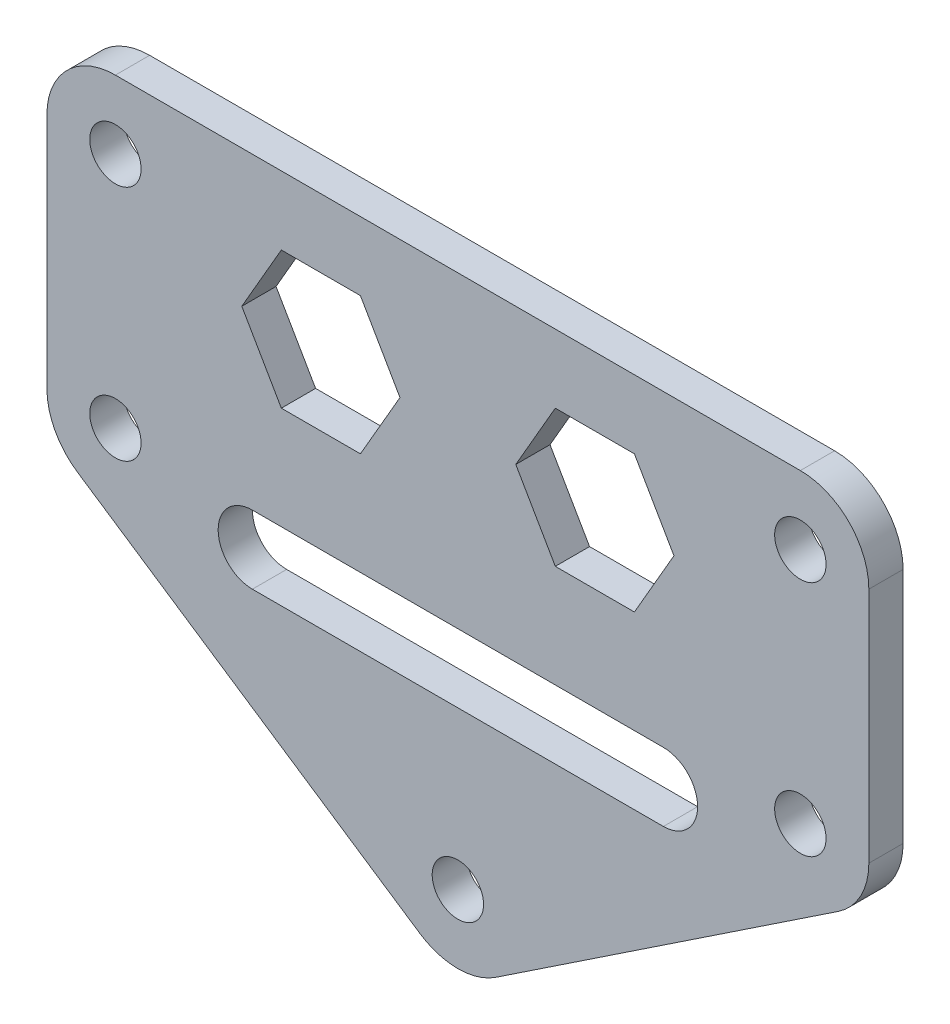
ISO-10303-21;
HEADER;
FILE_DESCRIPTION(('STEP AP214'),'2;1');
FILE_NAME('part.step','',(''),(''),'','','');
FILE_SCHEMA(('AUTOMOTIVE_DESIGN { 1 0 10303 214 1 1 1 1 }'));
ENDSEC;
DATA;
#1=APPLICATION_CONTEXT('core data for automotive mechanical design processes');
#2=APPLICATION_PROTOCOL_DEFINITION('international standard','automotive_design',2000,#1);
#3=PRODUCT_CONTEXT('',#1,'mechanical');
#4=PRODUCT('Part','Part','',(#3));
#5=PRODUCT_RELATED_PRODUCT_CATEGORY('part','',(#4));
#6=PRODUCT_DEFINITION_FORMATION('','',#4);
#7=PRODUCT_DEFINITION_CONTEXT('part definition',#1,'design');
#8=PRODUCT_DEFINITION('design','',#6,#7);
#9=PRODUCT_DEFINITION_SHAPE('','',#8);
#10=(LENGTH_UNIT() NAMED_UNIT(*) SI_UNIT(.MILLI.,.METRE.));
#11=(NAMED_UNIT(*) PLANE_ANGLE_UNIT() SI_UNIT($,.RADIAN.));
#12=(NAMED_UNIT(*) SI_UNIT($,.STERADIAN.) SOLID_ANGLE_UNIT());
#13=UNCERTAINTY_MEASURE_WITH_UNIT(LENGTH_MEASURE(1.E-05),#10,'distance_accuracy_value','');
#14=(GEOMETRIC_REPRESENTATION_CONTEXT(3) GLOBAL_UNCERTAINTY_ASSIGNED_CONTEXT((#13)) GLOBAL_UNIT_ASSIGNED_CONTEXT((#10,
#11,#12)) REPRESENTATION_CONTEXT('',''));
#15=CARTESIAN_POINT('',(0.,0.,0.));
#16=DIRECTION('',(0.,0.,1.));
#17=DIRECTION('',(1.,0.,0.));
#18=AXIS2_PLACEMENT_3D('',#15,#16,#17);
#19=CARTESIAN_POINT('',(63.5,57.5968337327975,6.35));
#20=DIRECTION('',(0.,0.,1.));
#21=DIRECTION('',(1.,0.,0.));
#22=AXIS2_PLACEMENT_3D('',#19,#20,#21);
#23=PLANE('',#22);
#24=CARTESIAN_POINT('',(63.5,57.5968337327975,6.35));
#25=DIRECTION('',(0.,0.,1.));
#26=DIRECTION('',(1.,0.,0.));
#27=AXIS2_PLACEMENT_3D('',#24,#25,#26);
#28=CIRCLE('',#27,4.7625);
#29=CARTESIAN_POINT('',(68.2625,57.5968337327975,6.35));
#30=VERTEX_POINT('',#29);
#31=EDGE_CURVE('E400',#30,#30,#28,.T.);
#32=ORIENTED_EDGE('',*,*,#31,.F.);
#33=EDGE_LOOP('',(#32));
#34=FACE_BOUND('',#33,.T.);
#35=CARTESIAN_POINT('',(-63.5,57.5968337327975,6.35));
#36=DIRECTION('',(0.,0.,1.));
#37=DIRECTION('',(1.,0.,0.));
#38=AXIS2_PLACEMENT_3D('',#35,#36,#37);
#39=CIRCLE('',#38,4.7625);
#40=CARTESIAN_POINT('',(-58.7375,57.5968337327975,6.35));
#41=VERTEX_POINT('',#40);
#42=EDGE_CURVE('E416',#41,#41,#39,.T.);
#43=ORIENTED_EDGE('',*,*,#42,.F.);
#44=EDGE_LOOP('',(#43));
#45=FACE_BOUND('',#44,.T.);
#46=CARTESIAN_POINT('',(63.5,57.5968337327975,6.35));
#47=DIRECTION('',(0.,0.,1.));
#48=DIRECTION('',(1.,0.,0.));
#49=AXIS2_PLACEMENT_3D('',#46,#47,#48);
#50=CIRCLE('',#49,12.7);
#51=CARTESIAN_POINT('',(70.5446924920604,47.029794994707,6.35));
#52=VERTEX_POINT('',#51);
#53=CARTESIAN_POINT('',(76.2,57.5968337327976,6.35));
#54=VERTEX_POINT('',#53);
#55=EDGE_CURVE('E432',#52,#54,#50,.T.);
#56=ORIENTED_EDGE('',*,*,#55,.T.);
#57=DIRECTION('',(0.,1.,0.));
#58=VECTOR('',#57,1.);
#59=CARTESIAN_POINT('',(76.2,57.5968337327976,6.35));
#60=LINE('',#59,#58);
#61=CARTESIAN_POINT('',(76.2,101.6,6.35));
#62=VERTEX_POINT('',#61);
#63=EDGE_CURVE('E436',#54,#62,#60,.T.);
#64=ORIENTED_EDGE('',*,*,#63,.T.);
#65=CARTESIAN_POINT('',(63.5,101.6,6.35));
#66=DIRECTION('',(0.,0.,1.));
#67=DIRECTION('',(1.,0.,0.));
#68=AXIS2_PLACEMENT_3D('',#65,#66,#67);
#69=CIRCLE('',#68,12.7);
#70=CARTESIAN_POINT('',(63.4999999999999,114.3,6.35));
#71=VERTEX_POINT('',#70);
#72=EDGE_CURVE('E440',#62,#71,#69,.T.);
#73=ORIENTED_EDGE('',*,*,#72,.T.);
#74=DIRECTION('',(-1.,0.,0.));
#75=VECTOR('',#74,1.);
#76=CARTESIAN_POINT('',(63.4999999999999,114.3,6.35));
#77=LINE('',#76,#75);
#78=CARTESIAN_POINT('',(-63.4999999999999,114.3,6.35));
#79=VERTEX_POINT('',#78);
#80=EDGE_CURVE('E443',#71,#79,#77,.T.);
#81=ORIENTED_EDGE('',*,*,#80,.T.);
#82=CARTESIAN_POINT('',(-63.5,101.6,6.35));
#83=DIRECTION('',(0.,0.,1.));
#84=DIRECTION('',(1.,0.,0.));
#85=AXIS2_PLACEMENT_3D('',#82,#83,#84);
#86=CIRCLE('',#85,12.7);
#87=CARTESIAN_POINT('',(-76.2,101.6,6.35));
#88=VERTEX_POINT('',#87);
#89=EDGE_CURVE('E446',#79,#88,#86,.T.);
#90=ORIENTED_EDGE('',*,*,#89,.T.);
#91=DIRECTION('',(0.,-1.,0.));
#92=VECTOR('',#91,1.);
#93=CARTESIAN_POINT('',(-76.2,101.6,6.35));
#94=LINE('',#93,#92);
#95=CARTESIAN_POINT('',(-76.2,57.5968337327975,6.35));
#96=VERTEX_POINT('',#95);
#97=EDGE_CURVE('E449',#88,#96,#94,.T.);
#98=ORIENTED_EDGE('',*,*,#97,.T.);
#99=CARTESIAN_POINT('',(-63.5,57.5968337327975,6.35));
#100=DIRECTION('',(0.,0.,1.));
#101=DIRECTION('',(1.,0.,0.));
#102=AXIS2_PLACEMENT_3D('',#99,#100,#101);
#103=CIRCLE('',#102,12.7);
#104=CARTESIAN_POINT('',(-70.5446924920604,47.0297949947069,6.35));
#105=VERTEX_POINT('',#104);
#106=EDGE_CURVE('E452',#96,#105,#103,.T.);
#107=ORIENTED_EDGE('',*,*,#106,.T.);
#108=DIRECTION('',(0.832050294337844,-0.554700196225229,0.));
#109=VECTOR('',#108,1.);
#110=CARTESIAN_POINT('',(-70.5446924920604,47.0297949947069,6.35));
#111=LINE('',#110,#109);
#112=CARTESIAN_POINT('',(-7.0446924920604,4.6964616613736,6.35));
#113=VERTEX_POINT('',#112);
#114=EDGE_CURVE('E455',#105,#113,#111,.T.);
#115=ORIENTED_EDGE('',*,*,#114,.T.);
#116=CARTESIAN_POINT('',(0.,15.2635003994642,6.35));
#117=DIRECTION('',(0.,0.,1.));
#118=DIRECTION('',(-1.,0.,0.));
#119=AXIS2_PLACEMENT_3D('',#116,#117,#118);
#120=CIRCLE('',#119,12.7);
#121=CARTESIAN_POINT('',(7.04469249206042,4.6964616613736,6.35));
#122=VERTEX_POINT('',#121);
#123=EDGE_CURVE('E458',#113,#122,#120,.T.);
#124=ORIENTED_EDGE('',*,*,#123,.T.);
#125=DIRECTION('',(0.832050294337843,0.554700196225229,0.));
#126=VECTOR('',#125,1.);
#127=CARTESIAN_POINT('',(7.04469249206042,4.6964616613736,6.35));
#128=LINE('',#127,#126);
#129=EDGE_CURVE('E461',#122,#52,#128,.T.);
#130=ORIENTED_EDGE('',*,*,#129,.T.);
#131=EDGE_LOOP('',(#56,#64,#73,#81,#90,#98,#107,#115,#124,#130));
#132=FACE_BOUND('',#131,.T.);
#133=CARTESIAN_POINT('',(-63.5,101.6,6.35));
#134=DIRECTION('',(0.,0.,1.));
#135=DIRECTION('',(1.,0.,0.));
#136=AXIS2_PLACEMENT_3D('',#133,#134,#135);
#137=CIRCLE('',#136,4.7625);
#138=CARTESIAN_POINT('',(-58.7375,101.6,6.35));
#139=VERTEX_POINT('',#138);
#140=EDGE_CURVE('E424',#139,#139,#137,.T.);
#141=ORIENTED_EDGE('',*,*,#140,.F.);
#142=EDGE_LOOP('',(#141));
#143=FACE_BOUND('',#142,.T.);
#144=CARTESIAN_POINT('',(63.5,101.6,6.35));
#145=DIRECTION('',(0.,0.,1.));
#146=DIRECTION('',(1.,0.,0.));
#147=AXIS2_PLACEMENT_3D('',#144,#145,#146);
#148=CIRCLE('',#147,4.7625);
#149=CARTESIAN_POINT('',(68.2625,101.6,6.35));
#150=VERTEX_POINT('',#149);
#151=EDGE_CURVE('E408',#150,#150,#148,.T.);
#152=ORIENTED_EDGE('',*,*,#151,.F.);
#153=EDGE_LOOP('',(#152));
#154=FACE_BOUND('',#153,.T.);
#155=CARTESIAN_POINT('',(0.,15.2635003994642,6.35));
#156=DIRECTION('',(0.,0.,1.));
#157=DIRECTION('',(1.,0.,0.));
#158=AXIS2_PLACEMENT_3D('',#155,#156,#157);
#159=CIRCLE('',#158,4.7625);
#160=CARTESIAN_POINT('',(4.7625,15.2635003994642,6.35));
#161=VERTEX_POINT('',#160);
#162=EDGE_CURVE('E392',#161,#161,#159,.T.);
#163=ORIENTED_EDGE('',*,*,#162,.F.);
#164=EDGE_LOOP('',(#163));
#165=FACE_BOUND('',#164,.T.);
#166=DIRECTION('',(1.,0.,0.));
#167=VECTOR('',#166,1.);
#168=CARTESIAN_POINT('',(-38.1,44.45,6.35));
#169=LINE('',#168,#167);
#170=CARTESIAN_POINT('',(-38.1,44.45,6.35));
#171=VERTEX_POINT('',#170);
#172=CARTESIAN_POINT('',(38.1,44.45,6.35));
#173=VERTEX_POINT('',#172);
#174=EDGE_CURVE('E352',#171,#173,#169,.T.);
#175=ORIENTED_EDGE('',*,*,#174,.F.);
#176=CARTESIAN_POINT('',(-38.1,50.8,6.35));
#177=DIRECTION('',(0.,0.,1.));
#178=DIRECTION('',(1.,0.,0.));
#179=AXIS2_PLACEMENT_3D('',#176,#177,#178);
#180=CIRCLE('',#179,6.35);
#181=CARTESIAN_POINT('',(-38.1,57.15,6.35));
#182=VERTEX_POINT('',#181);
#183=EDGE_CURVE('E349',#182,#171,#180,.T.);
#184=ORIENTED_EDGE('',*,*,#183,.F.);
#185=DIRECTION('',(-1.,0.,0.));
#186=VECTOR('',#185,1.);
#187=CARTESIAN_POINT('',(-38.1,57.15,6.35));
#188=LINE('',#187,#186);
#189=CARTESIAN_POINT('',(38.1,57.15,6.35));
#190=VERTEX_POINT('',#189);
#191=EDGE_CURVE('E360',#190,#182,#188,.T.);
#192=ORIENTED_EDGE('',*,*,#191,.F.);
#193=CARTESIAN_POINT('',(38.1,50.8,6.35));
#194=DIRECTION('',(0.,0.,1.));
#195=DIRECTION('',(1.,0.,0.));
#196=AXIS2_PLACEMENT_3D('',#193,#194,#195);
#197=CIRCLE('',#196,6.35);
#198=EDGE_CURVE('E356',#173,#190,#197,.T.);
#199=ORIENTED_EDGE('',*,*,#198,.F.);
#200=EDGE_LOOP('',(#175,#184,#192,#199));
#201=FACE_BOUND('',#200,.T.);
#202=DIRECTION('',(-0.5,0.866025403784439,0.));
#203=VECTOR('',#202,1.);
#204=CARTESIAN_POINT('',(-10.7353031625835,88.9,6.35));
#205=LINE('',#204,#203);
#206=CARTESIAN_POINT('',(-10.7353031625835,88.9,6.35));
#207=VERTEX_POINT('',#206);
#208=CARTESIAN_POINT('',(-18.0676515812917,101.6,6.35));
#209=VERTEX_POINT('',#208);
#210=EDGE_CURVE('E289',#207,#209,#205,.T.);
#211=ORIENTED_EDGE('',*,*,#210,.F.);
#212=DIRECTION('',(0.5,0.866025403784439,0.));
#213=VECTOR('',#212,1.);
#214=CARTESIAN_POINT('',(-18.0676515812918,76.2,6.35));
#215=LINE('',#214,#213);
#216=CARTESIAN_POINT('',(-18.0676515812918,76.2,6.35));
#217=VERTEX_POINT('',#216);
#218=EDGE_CURVE('E286',#217,#207,#215,.T.);
#219=ORIENTED_EDGE('',*,*,#218,.F.);
#220=DIRECTION('',(1.,0.,0.));
#221=VECTOR('',#220,1.);
#222=CARTESIAN_POINT('',(-32.7323484187082,76.2,6.35));
#223=LINE('',#222,#221);
#224=CARTESIAN_POINT('',(-32.7323484187082,76.2,6.35));
#225=VERTEX_POINT('',#224);
#226=EDGE_CURVE('E303',#225,#217,#223,.T.);
#227=ORIENTED_EDGE('',*,*,#226,.F.);
#228=DIRECTION('',(0.5,-0.866025403784439,0.));
#229=VECTOR('',#228,1.);
#230=CARTESIAN_POINT('',(-40.0646968374165,88.9,6.35));
#231=LINE('',#230,#229);
#232=CARTESIAN_POINT('',(-40.0646968374165,88.9,6.35));
#233=VERTEX_POINT('',#232);
#234=EDGE_CURVE('E299',#233,#225,#231,.T.);
#235=ORIENTED_EDGE('',*,*,#234,.F.);
#236=DIRECTION('',(-0.5,-0.866025403784439,0.));
#237=VECTOR('',#236,1.);
#238=CARTESIAN_POINT('',(-32.7323484187083,101.6,6.35));
#239=LINE('',#238,#237);
#240=CARTESIAN_POINT('',(-32.7323484187083,101.6,6.35));
#241=VERTEX_POINT('',#240);
#242=EDGE_CURVE('E296',#241,#233,#239,.T.);
#243=ORIENTED_EDGE('',*,*,#242,.F.);
#244=DIRECTION('',(-1.,0.,0.));
#245=VECTOR('',#244,1.);
#246=CARTESIAN_POINT('',(-18.0676515812917,101.6,6.35));
#247=LINE('',#246,#245);
#248=EDGE_CURVE('E293',#209,#241,#247,.T.);
#249=ORIENTED_EDGE('',*,*,#248,.F.);
#250=EDGE_LOOP('',(#211,#219,#227,#235,#243,#249));
#251=FACE_BOUND('',#250,.T.);
#252=DIRECTION('',(-0.5,0.866025403784439,0.));
#253=VECTOR('',#252,1.);
#254=CARTESIAN_POINT('',(40.0646968374165,88.9,6.35));
#255=LINE('',#254,#253);
#256=CARTESIAN_POINT('',(40.0646968374165,88.9,6.35));
#257=VERTEX_POINT('',#256);
#258=CARTESIAN_POINT('',(32.7323484187082,101.6,6.35));
#259=VERTEX_POINT('',#258);
#260=EDGE_CURVE('E226',#257,#259,#255,.T.);
#261=ORIENTED_EDGE('',*,*,#260,.F.);
#262=DIRECTION('',(0.5,0.866025403784439,0.));
#263=VECTOR('',#262,1.);
#264=CARTESIAN_POINT('',(32.7323484187082,76.2,6.35));
#265=LINE('',#264,#263);
#266=CARTESIAN_POINT('',(32.7323484187082,76.2,6.35));
#267=VERTEX_POINT('',#266);
#268=EDGE_CURVE('E217',#267,#257,#265,.T.);
#269=ORIENTED_EDGE('',*,*,#268,.F.);
#270=DIRECTION('',(1.,0.,0.));
#271=VECTOR('',#270,1.);
#272=CARTESIAN_POINT('',(18.0676515812917,76.2,6.35));
#273=LINE('',#272,#271);
#274=CARTESIAN_POINT('',(18.0676515812917,76.2,6.35));
#275=VERTEX_POINT('',#274);
#276=EDGE_CURVE('E252',#275,#267,#273,.T.);
#277=ORIENTED_EDGE('',*,*,#276,.F.);
#278=DIRECTION('',(0.5,-0.866025403784439,0.));
#279=VECTOR('',#278,1.);
#280=CARTESIAN_POINT('',(10.7353031625835,88.9,6.35));
#281=LINE('',#280,#279);
#282=CARTESIAN_POINT('',(10.7353031625835,88.9,6.35));
#283=VERTEX_POINT('',#282);
#284=EDGE_CURVE('E249',#283,#275,#281,.T.);
#285=ORIENTED_EDGE('',*,*,#284,.F.);
#286=DIRECTION('',(-0.5,-0.866025403784439,0.));
#287=VECTOR('',#286,1.);
#288=CARTESIAN_POINT('',(18.0676515812918,101.6,6.35));
#289=LINE('',#288,#287);
#290=CARTESIAN_POINT('',(18.0676515812918,101.6,6.35));
#291=VERTEX_POINT('',#290);
#292=EDGE_CURVE('E244',#291,#283,#289,.T.);
#293=ORIENTED_EDGE('',*,*,#292,.F.);
#294=DIRECTION('',(-1.,0.,0.));
#295=VECTOR('',#294,1.);
#296=CARTESIAN_POINT('',(32.7323484187082,101.6,6.35));
#297=LINE('',#296,#295);
#298=EDGE_CURVE('E240',#259,#291,#297,.T.);
#299=ORIENTED_EDGE('',*,*,#298,.F.);
#300=EDGE_LOOP('',(#261,#269,#277,#285,#293,#299));
#301=FACE_BOUND('',#300,.T.);
#302=ADVANCED_FACE('F43',(#34,#45,#132,#143,#154,#165,#201,#251,#301),#23,.T.);
#303=CARTESIAN_POINT('',(63.5,57.5968337327975,0.));
#304=DIRECTION('',(0.,0.,1.));
#305=DIRECTION('',(1.,0.,0.));
#306=AXIS2_PLACEMENT_3D('',#303,#304,#305);
#307=PLANE('',#306);
#308=DIRECTION('',(0.5,0.866025403784439,0.));
#309=VECTOR('',#308,1.);
#310=CARTESIAN_POINT('',(-18.0676515812918,76.2,0.));
#311=LINE('',#310,#309);
#312=CARTESIAN_POINT('',(-18.0676515812918,76.2,0.));
#313=VERTEX_POINT('',#312);
#314=CARTESIAN_POINT('',(-10.7353031625835,88.9,0.));
#315=VERTEX_POINT('',#314);
#316=EDGE_CURVE('E235',#313,#315,#311,.T.);
#317=ORIENTED_EDGE('',*,*,#316,.T.);
#318=DIRECTION('',(-0.5,0.866025403784439,0.));
#319=VECTOR('',#318,1.);
#320=CARTESIAN_POINT('',(-10.7353031625835,88.9,0.));
#321=LINE('',#320,#319);
#322=CARTESIAN_POINT('',(-18.0676515812917,101.6,0.));
#323=VERTEX_POINT('',#322);
#324=EDGE_CURVE('E310',#315,#323,#321,.T.);
#325=ORIENTED_EDGE('',*,*,#324,.T.);
#326=DIRECTION('',(-1.,0.,0.));
#327=VECTOR('',#326,1.);
#328=CARTESIAN_POINT('',(-18.0676515812917,101.6,0.));
#329=LINE('',#328,#327);
#330=CARTESIAN_POINT('',(-32.7323484187083,101.6,0.));
#331=VERTEX_POINT('',#330);
#332=EDGE_CURVE('E314',#323,#331,#329,.T.);
#333=ORIENTED_EDGE('',*,*,#332,.T.);
#334=DIRECTION('',(-0.5,-0.866025403784439,0.));
#335=VECTOR('',#334,1.);
#336=CARTESIAN_POINT('',(-32.7323484187083,101.6,0.));
#337=LINE('',#336,#335);
#338=CARTESIAN_POINT('',(-40.0646968374165,88.9,0.));
#339=VERTEX_POINT('',#338);
#340=EDGE_CURVE('E318',#331,#339,#337,.T.);
#341=ORIENTED_EDGE('',*,*,#340,.T.);
#342=DIRECTION('',(0.5,-0.866025403784439,0.));
#343=VECTOR('',#342,1.);
#344=CARTESIAN_POINT('',(-40.0646968374165,88.9,0.));
#345=LINE('',#344,#343);
#346=CARTESIAN_POINT('',(-32.7323484187082,76.2,0.));
#347=VERTEX_POINT('',#346);
#348=EDGE_CURVE('E322',#339,#347,#345,.T.);
#349=ORIENTED_EDGE('',*,*,#348,.T.);
#350=DIRECTION('',(1.,0.,0.));
#351=VECTOR('',#350,1.);
#352=CARTESIAN_POINT('',(-32.7323484187082,76.2,0.));
#353=LINE('',#352,#351);
#354=EDGE_CURVE('E290',#347,#313,#353,.T.);
#355=ORIENTED_EDGE('',*,*,#354,.T.);
#356=EDGE_LOOP('',(#317,#325,#333,#341,#349,#355));
#357=FACE_BOUND('',#356,.T.);
#358=CARTESIAN_POINT('',(0.,15.2635003994642,0.));
#359=DIRECTION('',(0.,0.,1.));
#360=DIRECTION('',(1.,0.,0.));
#361=AXIS2_PLACEMENT_3D('',#358,#359,#360);
#362=CIRCLE('',#361,4.7625);
#363=CARTESIAN_POINT('',(4.7625,15.2635003994642,0.));
#364=VERTEX_POINT('',#363);
#365=EDGE_CURVE('E391',#364,#364,#362,.T.);
#366=ORIENTED_EDGE('',*,*,#365,.T.);
#367=EDGE_LOOP('',(#366));
#368=FACE_BOUND('',#367,.T.);
#369=CARTESIAN_POINT('',(63.5,57.5968337327975,0.));
#370=DIRECTION('',(0.,0.,1.));
#371=DIRECTION('',(1.,0.,0.));
#372=AXIS2_PLACEMENT_3D('',#369,#370,#371);
#373=CIRCLE('',#372,4.7625);
#374=CARTESIAN_POINT('',(68.2625,57.5968337327975,0.));
#375=VERTEX_POINT('',#374);
#376=EDGE_CURVE('E396',#375,#375,#373,.T.);
#377=ORIENTED_EDGE('',*,*,#376,.T.);
#378=EDGE_LOOP('',(#377));
#379=FACE_BOUND('',#378,.T.);
#380=CARTESIAN_POINT('',(63.5,101.6,0.));
#381=DIRECTION('',(0.,0.,1.));
#382=DIRECTION('',(1.,0.,0.));
#383=AXIS2_PLACEMENT_3D('',#380,#381,#382);
#384=CIRCLE('',#383,4.7625);
#385=CARTESIAN_POINT('',(68.2625,101.6,0.));
#386=VERTEX_POINT('',#385);
#387=EDGE_CURVE('E404',#386,#386,#384,.T.);
#388=ORIENTED_EDGE('',*,*,#387,.T.);
#389=EDGE_LOOP('',(#388));
#390=FACE_BOUND('',#389,.T.);
#391=CARTESIAN_POINT('',(-63.5,57.5968337327975,0.));
#392=DIRECTION('',(0.,0.,1.));
#393=DIRECTION('',(1.,0.,0.));
#394=AXIS2_PLACEMENT_3D('',#391,#392,#393);
#395=CIRCLE('',#394,4.7625);
#396=CARTESIAN_POINT('',(-58.7375,57.5968337327975,0.));
#397=VERTEX_POINT('',#396);
#398=EDGE_CURVE('E412',#397,#397,#395,.T.);
#399=ORIENTED_EDGE('',*,*,#398,.T.);
#400=EDGE_LOOP('',(#399));
#401=FACE_BOUND('',#400,.T.);
#402=CARTESIAN_POINT('',(-63.5,101.6,0.));
#403=DIRECTION('',(0.,0.,1.));
#404=DIRECTION('',(1.,0.,0.));
#405=AXIS2_PLACEMENT_3D('',#402,#403,#404);
#406=CIRCLE('',#405,4.7625);
#407=CARTESIAN_POINT('',(-58.7375,101.6,0.));
#408=VERTEX_POINT('',#407);
#409=EDGE_CURVE('E420',#408,#408,#406,.T.);
#410=ORIENTED_EDGE('',*,*,#409,.T.);
#411=EDGE_LOOP('',(#410));
#412=FACE_BOUND('',#411,.T.);
#413=CARTESIAN_POINT('',(63.5,57.5968337327975,0.));
#414=DIRECTION('',(0.,0.,1.));
#415=DIRECTION('',(1.,0.,0.));
#416=AXIS2_PLACEMENT_3D('',#413,#414,#415);
#417=CIRCLE('',#416,12.7);
#418=CARTESIAN_POINT('',(70.5446924920604,47.029794994707,0.));
#419=VERTEX_POINT('',#418);
#420=CARTESIAN_POINT('',(76.2,57.5968337327976,0.));
#421=VERTEX_POINT('',#420);
#422=EDGE_CURVE('E428',#419,#421,#417,.T.);
#423=ORIENTED_EDGE('',*,*,#422,.F.);
#424=DIRECTION('',(0.832050294337843,0.554700196225229,0.));
#425=VECTOR('',#424,1.);
#426=CARTESIAN_POINT('',(7.04469249206042,4.6964616613736,0.));
#427=LINE('',#426,#425);
#428=CARTESIAN_POINT('',(7.04469249206042,4.6964616613736,0.));
#429=VERTEX_POINT('',#428);
#430=EDGE_CURVE('E437',#429,#419,#427,.T.);
#431=ORIENTED_EDGE('',*,*,#430,.F.);
#432=CARTESIAN_POINT('',(0.,15.2635003994642,0.));
#433=DIRECTION('',(0.,0.,1.));
#434=DIRECTION('',(-1.,0.,0.));
#435=AXIS2_PLACEMENT_3D('',#432,#433,#434);
#436=CIRCLE('',#435,12.7);
#437=CARTESIAN_POINT('',(-7.0446924920604,4.6964616613736,0.));
#438=VERTEX_POINT('',#437);
#439=EDGE_CURVE('E489',#438,#429,#436,.T.);
#440=ORIENTED_EDGE('',*,*,#439,.F.);
#441=DIRECTION('',(0.832050294337844,-0.554700196225229,0.));
#442=VECTOR('',#441,1.);
#443=CARTESIAN_POINT('',(-70.5446924920604,47.0297949947069,0.));
#444=LINE('',#443,#442);
#445=CARTESIAN_POINT('',(-70.5446924920604,47.0297949947069,0.));
#446=VERTEX_POINT('',#445);
#447=EDGE_CURVE('E486',#446,#438,#444,.T.);
#448=ORIENTED_EDGE('',*,*,#447,.F.);
#449=CARTESIAN_POINT('',(-63.5,57.5968337327975,0.));
#450=DIRECTION('',(0.,0.,1.));
#451=DIRECTION('',(1.,0.,0.));
#452=AXIS2_PLACEMENT_3D('',#449,#450,#451);
#453=CIRCLE('',#452,12.7);
#454=CARTESIAN_POINT('',(-76.2,57.5968337327975,0.));
#455=VERTEX_POINT('',#454);
#456=EDGE_CURVE('E483',#455,#446,#453,.T.);
#457=ORIENTED_EDGE('',*,*,#456,.F.);
#458=DIRECTION('',(0.,-1.,0.));
#459=VECTOR('',#458,1.);
#460=CARTESIAN_POINT('',(-76.2,101.6,0.));
#461=LINE('',#460,#459);
#462=CARTESIAN_POINT('',(-76.2,101.6,0.));
#463=VERTEX_POINT('',#462);
#464=EDGE_CURVE('E480',#463,#455,#461,.T.);
#465=ORIENTED_EDGE('',*,*,#464,.F.);
#466=CARTESIAN_POINT('',(-63.5,101.6,0.));
#467=DIRECTION('',(0.,0.,1.));
#468=DIRECTION('',(1.,0.,0.));
#469=AXIS2_PLACEMENT_3D('',#466,#467,#468);
#470=CIRCLE('',#469,12.7);
#471=CARTESIAN_POINT('',(-63.4999999999999,114.3,0.));
#472=VERTEX_POINT('',#471);
#473=EDGE_CURVE('E477',#472,#463,#470,.T.);
#474=ORIENTED_EDGE('',*,*,#473,.F.);
#475=DIRECTION('',(-1.,0.,0.));
#476=VECTOR('',#475,1.);
#477=CARTESIAN_POINT('',(63.4999999999999,114.3,0.));
#478=LINE('',#477,#476);
#479=CARTESIAN_POINT('',(63.4999999999999,114.3,0.));
#480=VERTEX_POINT('',#479);
#481=EDGE_CURVE('E474',#480,#472,#478,.T.);
#482=ORIENTED_EDGE('',*,*,#481,.F.);
#483=CARTESIAN_POINT('',(63.5,101.6,0.));
#484=DIRECTION('',(0.,0.,1.));
#485=DIRECTION('',(1.,0.,0.));
#486=AXIS2_PLACEMENT_3D('',#483,#484,#485);
#487=CIRCLE('',#486,12.7);
#488=CARTESIAN_POINT('',(76.2,101.6,0.));
#489=VERTEX_POINT('',#488);
#490=EDGE_CURVE('E471',#489,#480,#487,.T.);
#491=ORIENTED_EDGE('',*,*,#490,.F.);
#492=DIRECTION('',(0.,1.,0.));
#493=VECTOR('',#492,1.);
#494=CARTESIAN_POINT('',(76.2,57.5968337327976,0.));
#495=LINE('',#494,#493);
#496=EDGE_CURVE('E468',#421,#489,#495,.T.);
#497=ORIENTED_EDGE('',*,*,#496,.F.);
#498=EDGE_LOOP('',(#423,#431,#440,#448,#457,#465,#474,#482,#491,#497));
#499=FACE_BOUND('',#498,.T.);
#500=CARTESIAN_POINT('',(-38.1,50.8,0.));
#501=DIRECTION('',(0.,0.,1.));
#502=DIRECTION('',(1.,0.,0.));
#503=AXIS2_PLACEMENT_3D('',#500,#501,#502);
#504=CIRCLE('',#503,6.35);
#505=CARTESIAN_POINT('',(-38.1,57.15,0.));
#506=VERTEX_POINT('',#505);
#507=CARTESIAN_POINT('',(-38.1,44.45,0.));
#508=VERTEX_POINT('',#507);
#509=EDGE_CURVE('E348',#506,#508,#504,.T.);
#510=ORIENTED_EDGE('',*,*,#509,.T.);
#511=DIRECTION('',(1.,0.,0.));
#512=VECTOR('',#511,1.);
#513=CARTESIAN_POINT('',(-38.1,44.45,0.));
#514=LINE('',#513,#512);
#515=CARTESIAN_POINT('',(38.1,44.45,0.));
#516=VERTEX_POINT('',#515);
#517=EDGE_CURVE('E367',#508,#516,#514,.T.);
#518=ORIENTED_EDGE('',*,*,#517,.T.);
#519=CARTESIAN_POINT('',(38.1,50.8,0.));
#520=DIRECTION('',(0.,0.,1.));
#521=DIRECTION('',(1.,0.,0.));
#522=AXIS2_PLACEMENT_3D('',#519,#520,#521);
#523=CIRCLE('',#522,6.35);
#524=CARTESIAN_POINT('',(38.1,57.15,0.));
#525=VERTEX_POINT('',#524);
#526=EDGE_CURVE('E371',#516,#525,#523,.T.);
#527=ORIENTED_EDGE('',*,*,#526,.T.);
#528=DIRECTION('',(-1.,0.,0.));
#529=VECTOR('',#528,1.);
#530=CARTESIAN_POINT('',(-38.1,57.15,0.));
#531=LINE('',#530,#529);
#532=EDGE_CURVE('E353',#525,#506,#531,.T.);
#533=ORIENTED_EDGE('',*,*,#532,.T.);
#534=EDGE_LOOP('',(#510,#518,#527,#533));
#535=FACE_BOUND('',#534,.T.);
#536=DIRECTION('',(0.5,0.866025403784439,0.));
#537=VECTOR('',#536,1.);
#538=CARTESIAN_POINT('',(32.7323484187082,76.2,0.));
#539=LINE('',#538,#537);
#540=CARTESIAN_POINT('',(32.7323484187082,76.2,0.));
#541=VERTEX_POINT('',#540);
#542=CARTESIAN_POINT('',(40.0646968374165,88.9,0.));
#543=VERTEX_POINT('',#542);
#544=EDGE_CURVE('E67',#541,#543,#539,.T.);
#545=ORIENTED_EDGE('',*,*,#544,.T.);
#546=DIRECTION('',(-0.5,0.866025403784439,0.));
#547=VECTOR('',#546,1.);
#548=CARTESIAN_POINT('',(40.0646968374165,88.9,0.));
#549=LINE('',#548,#547);
#550=CARTESIAN_POINT('',(32.7323484187082,101.6,0.));
#551=VERTEX_POINT('',#550);
#552=EDGE_CURVE('E233',#543,#551,#549,.T.);
#553=ORIENTED_EDGE('',*,*,#552,.T.);
#554=DIRECTION('',(-1.,0.,0.));
#555=VECTOR('',#554,1.);
#556=CARTESIAN_POINT('',(32.7323484187082,101.6,0.));
#557=LINE('',#556,#555);
#558=CARTESIAN_POINT('',(18.0676515812918,101.6,0.));
#559=VERTEX_POINT('',#558);
#560=EDGE_CURVE('E259',#551,#559,#557,.T.);
#561=ORIENTED_EDGE('',*,*,#560,.T.);
#562=DIRECTION('',(-0.5,-0.866025403784439,0.));
#563=VECTOR('',#562,1.);
#564=CARTESIAN_POINT('',(18.0676515812918,101.6,0.));
#565=LINE('',#564,#563);
#566=CARTESIAN_POINT('',(10.7353031625835,88.9,0.));
#567=VERTEX_POINT('',#566);
#568=EDGE_CURVE('E263',#559,#567,#565,.T.);
#569=ORIENTED_EDGE('',*,*,#568,.T.);
#570=DIRECTION('',(0.5,-0.866025403784439,0.));
#571=VECTOR('',#570,1.);
#572=CARTESIAN_POINT('',(10.7353031625835,88.9,0.));
#573=LINE('',#572,#571);
#574=CARTESIAN_POINT('',(18.0676515812917,76.2,0.));
#575=VERTEX_POINT('',#574);
#576=EDGE_CURVE('E267',#567,#575,#573,.T.);
#577=ORIENTED_EDGE('',*,*,#576,.T.);
#578=DIRECTION('',(1.,0.,0.));
#579=VECTOR('',#578,1.);
#580=CARTESIAN_POINT('',(18.0676515812917,76.2,0.));
#581=LINE('',#580,#579);
#582=EDGE_CURVE('E227',#575,#541,#581,.T.);
#583=ORIENTED_EDGE('',*,*,#582,.T.);
#584=EDGE_LOOP('',(#545,#553,#561,#569,#577,#583));
#585=FACE_BOUND('',#584,.T.);
#586=ADVANCED_FACE('F536',(#357,#368,#379,#390,#401,#412,#499,#535,#585),#307,.F.);
#587=CARTESIAN_POINT('',(63.5,57.5968337327975,6.35));
#588=DIRECTION('',(0.,0.,-1.));
#589=DIRECTION('',(-1.,0.,0.));
#590=AXIS2_PLACEMENT_3D('',#587,#588,#589);
#591=CYLINDRICAL_SURFACE('',#590,12.7);
#592=ORIENTED_EDGE('',*,*,#422,.T.);
#593=DIRECTION('',(0.,0.,-1.));
#594=VECTOR('',#593,1.);
#595=CARTESIAN_POINT('',(76.2,57.5968337327976,6.35));
#596=LINE('',#595,#594);
#597=EDGE_CURVE('E11',#54,#421,#596,.T.);
#598=ORIENTED_EDGE('',*,*,#597,.F.);
#599=ORIENTED_EDGE('',*,*,#55,.F.);
#600=DIRECTION('',(0.,0.,-1.));
#601=VECTOR('',#600,1.);
#602=CARTESIAN_POINT('',(70.5446924920604,47.029794994707,6.35));
#603=LINE('',#602,#601);
#604=EDGE_CURVE('E464',#52,#419,#603,.T.);
#605=ORIENTED_EDGE('',*,*,#604,.T.);
#606=EDGE_LOOP('',(#592,#598,#599,#605));
#607=FACE_BOUND('',#606,.T.);
#608=ADVANCED_FACE('F45',(#607),#591,.T.);
#609=CARTESIAN_POINT('',(76.2,57.5968337327976,6.35));
#610=DIRECTION('',(-1.,0.,0.));
#611=DIRECTION('',(0.,-1.,0.));
#612=AXIS2_PLACEMENT_3D('',#609,#610,#611);
#613=PLANE('',#612);
#614=ORIENTED_EDGE('',*,*,#496,.T.);
#615=DIRECTION('',(0.,0.,-1.));
#616=VECTOR('',#615,1.);
#617=CARTESIAN_POINT('',(76.2,101.6,6.35));
#618=LINE('',#617,#616);
#619=EDGE_CURVE('E52',#62,#489,#618,.T.);
#620=ORIENTED_EDGE('',*,*,#619,.F.);
#621=ORIENTED_EDGE('',*,*,#63,.F.);
#622=ORIENTED_EDGE('',*,*,#597,.T.);
#623=EDGE_LOOP('',(#614,#620,#621,#622));
#624=FACE_BOUND('',#623,.T.);
#625=ADVANCED_FACE('F554',(#624),#613,.F.);
#626=CARTESIAN_POINT('',(63.5,101.6,6.35));
#627=DIRECTION('',(0.,0.,-1.));
#628=DIRECTION('',(-1.,0.,0.));
#629=AXIS2_PLACEMENT_3D('',#626,#627,#628);
#630=CYLINDRICAL_SURFACE('',#629,12.7);
#631=ORIENTED_EDGE('',*,*,#490,.T.);
#632=DIRECTION('',(0.,0.,-1.));
#633=VECTOR('',#632,1.);
#634=CARTESIAN_POINT('',(63.4999999999999,114.3,6.35));
#635=LINE('',#634,#633);
#636=EDGE_CURVE('E521',#71,#480,#635,.T.);
#637=ORIENTED_EDGE('',*,*,#636,.F.);
#638=ORIENTED_EDGE('',*,*,#72,.F.);
#639=ORIENTED_EDGE('',*,*,#619,.T.);
#640=EDGE_LOOP('',(#631,#637,#638,#639));
#641=FACE_BOUND('',#640,.T.);
#642=ADVANCED_FACE('F530',(#641),#630,.T.);
#643=CARTESIAN_POINT('',(63.4999999999999,114.3,6.35));
#644=DIRECTION('',(0.,-1.,0.));
#645=DIRECTION('',(0.,0.,-1.));
#646=AXIS2_PLACEMENT_3D('',#643,#644,#645);
#647=PLANE('',#646);
#648=ORIENTED_EDGE('',*,*,#481,.T.);
#649=DIRECTION('',(0.,0.,-1.));
#650=VECTOR('',#649,1.);
#651=CARTESIAN_POINT('',(-63.4999999999999,114.3,6.35));
#652=LINE('',#651,#650);
#653=EDGE_CURVE('E517',#79,#472,#652,.T.);
#654=ORIENTED_EDGE('',*,*,#653,.F.);
#655=ORIENTED_EDGE('',*,*,#80,.F.);
#656=ORIENTED_EDGE('',*,*,#636,.T.);
#657=EDGE_LOOP('',(#648,#654,#655,#656));
#658=FACE_BOUND('',#657,.T.);
#659=ADVANCED_FACE('F542',(#658),#647,.F.);
#660=CARTESIAN_POINT('',(-63.5,101.6,6.35));
#661=DIRECTION('',(0.,0.,-1.));
#662=DIRECTION('',(-1.,0.,0.));
#663=AXIS2_PLACEMENT_3D('',#660,#661,#662);
#664=CYLINDRICAL_SURFACE('',#663,12.7);
#665=ORIENTED_EDGE('',*,*,#473,.T.);
#666=DIRECTION('',(0.,0.,-1.));
#667=VECTOR('',#666,1.);
#668=CARTESIAN_POINT('',(-76.2,101.6,6.35));
#669=LINE('',#668,#667);
#670=EDGE_CURVE('E513',#88,#463,#669,.T.);
#671=ORIENTED_EDGE('',*,*,#670,.F.);
#672=ORIENTED_EDGE('',*,*,#89,.F.);
#673=ORIENTED_EDGE('',*,*,#653,.T.);
#674=EDGE_LOOP('',(#665,#671,#672,#673));
#675=FACE_BOUND('',#674,.T.);
#676=ADVANCED_FACE('F546',(#675),#664,.T.);
#677=CARTESIAN_POINT('',(-76.2,101.6,6.35));
#678=DIRECTION('',(1.,0.,0.));
#679=DIRECTION('',(0.,0.,-1.));
#680=AXIS2_PLACEMENT_3D('',#677,#678,#679);
#681=PLANE('',#680);
#682=ORIENTED_EDGE('',*,*,#464,.T.);
#683=DIRECTION('',(0.,0.,-1.));
#684=VECTOR('',#683,1.);
#685=CARTESIAN_POINT('',(-76.2,57.5968337327975,6.35));
#686=LINE('',#685,#684);
#687=EDGE_CURVE('E509',#96,#455,#686,.T.);
#688=ORIENTED_EDGE('',*,*,#687,.F.);
#689=ORIENTED_EDGE('',*,*,#97,.F.);
#690=ORIENTED_EDGE('',*,*,#670,.T.);
#691=EDGE_LOOP('',(#682,#688,#689,#690));
#692=FACE_BOUND('',#691,.T.);
#693=ADVANCED_FACE('F577',(#692),#681,.F.);
#694=CARTESIAN_POINT('',(-63.5,57.5968337327975,6.35));
#695=DIRECTION('',(0.,0.,-1.));
#696=DIRECTION('',(-1.,0.,0.));
#697=AXIS2_PLACEMENT_3D('',#694,#695,#696);
#698=CYLINDRICAL_SURFACE('',#697,12.7);
#699=ORIENTED_EDGE('',*,*,#456,.T.);
#700=DIRECTION('',(0.,0.,-1.));
#701=VECTOR('',#700,1.);
#702=CARTESIAN_POINT('',(-70.5446924920604,47.0297949947069,6.35));
#703=LINE('',#702,#701);
#704=EDGE_CURVE('E505',#105,#446,#703,.T.);
#705=ORIENTED_EDGE('',*,*,#704,.F.);
#706=ORIENTED_EDGE('',*,*,#106,.F.);
#707=ORIENTED_EDGE('',*,*,#687,.T.);
#708=EDGE_LOOP('',(#699,#705,#706,#707));
#709=FACE_BOUND('',#708,.T.);
#710=ADVANCED_FACE('F574',(#709),#698,.T.);
#711=CARTESIAN_POINT('',(-70.5446924920604,47.0297949947069,6.35));
#712=DIRECTION('',(0.554700196225229,0.832050294337844,0.));
#713=DIRECTION('',(-0.832050294337844,0.554700196225229,0.));
#714=AXIS2_PLACEMENT_3D('',#711,#712,#713);
#715=PLANE('',#714);
#716=ORIENTED_EDGE('',*,*,#447,.T.);
#717=DIRECTION('',(0.,0.,-1.));
#718=VECTOR('',#717,1.);
#719=CARTESIAN_POINT('',(-7.0446924920604,4.6964616613736,6.35));
#720=LINE('',#719,#718);
#721=EDGE_CURVE('E501',#113,#438,#720,.T.);
#722=ORIENTED_EDGE('',*,*,#721,.F.);
#723=ORIENTED_EDGE('',*,*,#114,.F.);
#724=ORIENTED_EDGE('',*,*,#704,.T.);
#725=EDGE_LOOP('',(#716,#722,#723,#724));
#726=FACE_BOUND('',#725,.T.);
#727=ADVANCED_FACE('F570',(#726),#715,.F.);
#728=CARTESIAN_POINT('',(0.,15.2635003994642,6.35));
#729=DIRECTION('',(0.,0.,-1.));
#730=DIRECTION('',(-1.,0.,0.));
#731=AXIS2_PLACEMENT_3D('',#728,#729,#730);
#732=CYLINDRICAL_SURFACE('',#731,12.7);
#733=ORIENTED_EDGE('',*,*,#439,.T.);
#734=DIRECTION('',(0.,0.,-1.));
#735=VECTOR('',#734,1.);
#736=CARTESIAN_POINT('',(7.04469249206042,4.6964616613736,6.35));
#737=LINE('',#736,#735);
#738=EDGE_CURVE('E497',#122,#429,#737,.T.);
#739=ORIENTED_EDGE('',*,*,#738,.F.);
#740=ORIENTED_EDGE('',*,*,#123,.F.);
#741=ORIENTED_EDGE('',*,*,#721,.T.);
#742=EDGE_LOOP('',(#733,#739,#740,#741));
#743=FACE_BOUND('',#742,.T.);
#744=ADVANCED_FACE('F566',(#743),#732,.T.);
#745=CARTESIAN_POINT('',(7.04469249206042,4.6964616613736,6.35));
#746=DIRECTION('',(-0.554700196225229,0.832050294337843,0.));
#747=DIRECTION('',(-0.832050294337843,-0.554700196225229,0.));
#748=AXIS2_PLACEMENT_3D('',#745,#746,#747);
#749=PLANE('',#748);
#750=ORIENTED_EDGE('',*,*,#430,.T.);
#751=ORIENTED_EDGE('',*,*,#604,.F.);
#752=ORIENTED_EDGE('',*,*,#129,.F.);
#753=ORIENTED_EDGE('',*,*,#738,.T.);
#754=EDGE_LOOP('',(#750,#751,#752,#753));
#755=FACE_BOUND('',#754,.T.);
#756=ADVANCED_FACE('F561',(#755),#749,.F.);
#757=CARTESIAN_POINT('',(-63.5,101.6,6.35));
#758=DIRECTION('',(0.,0.,-1.));
#759=DIRECTION('',(-1.,0.,0.));
#760=AXIS2_PLACEMENT_3D('',#757,#758,#759);
#761=CYLINDRICAL_SURFACE('',#760,4.7625);
#762=ORIENTED_EDGE('',*,*,#140,.T.);
#763=EDGE_LOOP('',(#762));
#764=FACE_BOUND('',#763,.T.);
#765=ORIENTED_EDGE('',*,*,#409,.F.);
#766=EDGE_LOOP('',(#765));
#767=FACE_BOUND('',#766,.T.);
#768=ADVANCED_FACE('F597',(#764,#767),#761,.F.);
#769=CARTESIAN_POINT('',(-63.5,57.5968337327975,6.35));
#770=DIRECTION('',(0.,0.,-1.));
#771=DIRECTION('',(-1.,0.,0.));
#772=AXIS2_PLACEMENT_3D('',#769,#770,#771);
#773=CYLINDRICAL_SURFACE('',#772,4.7625);
#774=ORIENTED_EDGE('',*,*,#42,.T.);
#775=EDGE_LOOP('',(#774));
#776=FACE_BOUND('',#775,.T.);
#777=ORIENTED_EDGE('',*,*,#398,.F.);
#778=EDGE_LOOP('',(#777));
#779=FACE_BOUND('',#778,.T.);
#780=ADVANCED_FACE('F623',(#776,#779),#773,.F.);
#781=CARTESIAN_POINT('',(63.5,101.6,6.35));
#782=DIRECTION('',(0.,0.,-1.));
#783=DIRECTION('',(-1.,0.,0.));
#784=AXIS2_PLACEMENT_3D('',#781,#782,#783);
#785=CYLINDRICAL_SURFACE('',#784,4.7625);
#786=ORIENTED_EDGE('',*,*,#151,.T.);
#787=EDGE_LOOP('',(#786));
#788=FACE_BOUND('',#787,.T.);
#789=ORIENTED_EDGE('',*,*,#387,.F.);
#790=EDGE_LOOP('',(#789));
#791=FACE_BOUND('',#790,.T.);
#792=ADVANCED_FACE('F630',(#788,#791),#785,.F.);
#793=CARTESIAN_POINT('',(63.5,57.5968337327975,6.35));
#794=DIRECTION('',(0.,0.,-1.));
#795=DIRECTION('',(-1.,0.,0.));
#796=AXIS2_PLACEMENT_3D('',#793,#794,#795);
#797=CYLINDRICAL_SURFACE('',#796,4.7625);
#798=ORIENTED_EDGE('',*,*,#31,.T.);
#799=EDGE_LOOP('',(#798));
#800=FACE_BOUND('',#799,.T.);
#801=ORIENTED_EDGE('',*,*,#376,.F.);
#802=EDGE_LOOP('',(#801));
#803=FACE_BOUND('',#802,.T.);
#804=ADVANCED_FACE('F637',(#800,#803),#797,.F.);
#805=CARTESIAN_POINT('',(0.,15.2635003994642,6.35));
#806=DIRECTION('',(0.,0.,-1.));
#807=DIRECTION('',(-1.,0.,0.));
#808=AXIS2_PLACEMENT_3D('',#805,#806,#807);
#809=CYLINDRICAL_SURFACE('',#808,4.7625);
#810=ORIENTED_EDGE('',*,*,#162,.T.);
#811=EDGE_LOOP('',(#810));
#812=FACE_BOUND('',#811,.T.);
#813=ORIENTED_EDGE('',*,*,#365,.F.);
#814=EDGE_LOOP('',(#813));
#815=FACE_BOUND('',#814,.T.);
#816=ADVANCED_FACE('F645',(#812,#815),#809,.F.);
#817=CARTESIAN_POINT('',(-38.1,50.8,6.35));
#818=DIRECTION('',(0.,0.,-1.));
#819=DIRECTION('',(-1.,0.,0.));
#820=AXIS2_PLACEMENT_3D('',#817,#818,#819);
#821=CYLINDRICAL_SURFACE('',#820,6.35);
#822=ORIENTED_EDGE('',*,*,#509,.F.);
#823=DIRECTION('',(0.,0.,-1.));
#824=VECTOR('',#823,1.);
#825=CARTESIAN_POINT('',(-38.1,57.15,6.35));
#826=LINE('',#825,#824);
#827=EDGE_CURVE('E363',#182,#506,#826,.T.);
#828=ORIENTED_EDGE('',*,*,#827,.F.);
#829=ORIENTED_EDGE('',*,*,#183,.T.);
#830=DIRECTION('',(0.,0.,-1.));
#831=VECTOR('',#830,1.);
#832=CARTESIAN_POINT('',(-38.1,44.45,6.35));
#833=LINE('',#832,#831);
#834=EDGE_CURVE('E387',#171,#508,#833,.T.);
#835=ORIENTED_EDGE('',*,*,#834,.T.);
#836=EDGE_LOOP('',(#822,#828,#829,#835));
#837=FACE_BOUND('',#836,.T.);
#838=ADVANCED_FACE('F653',(#837),#821,.F.);
#839=CARTESIAN_POINT('',(-38.1,44.45,6.35));
#840=DIRECTION('',(0.,1.,0.));
#841=DIRECTION('',(-1.,0.,0.));
#842=AXIS2_PLACEMENT_3D('',#839,#840,#841);
#843=PLANE('',#842);
#844=ORIENTED_EDGE('',*,*,#517,.F.);
#845=ORIENTED_EDGE('',*,*,#834,.F.);
#846=ORIENTED_EDGE('',*,*,#174,.T.);
#847=DIRECTION('',(0.,0.,-1.));
#848=VECTOR('',#847,1.);
#849=CARTESIAN_POINT('',(38.1,44.45,6.35));
#850=LINE('',#849,#848);
#851=EDGE_CURVE('E384',#173,#516,#850,.T.);
#852=ORIENTED_EDGE('',*,*,#851,.T.);
#853=EDGE_LOOP('',(#844,#845,#846,#852));
#854=FACE_BOUND('',#853,.T.);
#855=ADVANCED_FACE('F661',(#854),#843,.T.);
#856=CARTESIAN_POINT('',(38.1,50.8,6.35));
#857=DIRECTION('',(0.,0.,-1.));
#858=DIRECTION('',(-1.,0.,0.));
#859=AXIS2_PLACEMENT_3D('',#856,#857,#858);
#860=CYLINDRICAL_SURFACE('',#859,6.35);
#861=ORIENTED_EDGE('',*,*,#526,.F.);
#862=ORIENTED_EDGE('',*,*,#851,.F.);
#863=ORIENTED_EDGE('',*,*,#198,.T.);
#864=DIRECTION('',(0.,0.,-1.));
#865=VECTOR('',#864,1.);
#866=CARTESIAN_POINT('',(38.1,57.15,6.35));
#867=LINE('',#866,#865);
#868=EDGE_CURVE('E381',#190,#525,#867,.T.);
#869=ORIENTED_EDGE('',*,*,#868,.T.);
#870=EDGE_LOOP('',(#861,#862,#863,#869));
#871=FACE_BOUND('',#870,.T.);
#872=ADVANCED_FACE('F669',(#871),#860,.F.);
#873=CARTESIAN_POINT('',(-38.1,57.15,6.35));
#874=DIRECTION('',(0.,-1.,0.));
#875=DIRECTION('',(1.,0.,0.));
#876=AXIS2_PLACEMENT_3D('',#873,#874,#875);
#877=PLANE('',#876);
#878=ORIENTED_EDGE('',*,*,#532,.F.);
#879=ORIENTED_EDGE('',*,*,#868,.F.);
#880=ORIENTED_EDGE('',*,*,#191,.T.);
#881=ORIENTED_EDGE('',*,*,#827,.T.);
#882=EDGE_LOOP('',(#878,#879,#880,#881));
#883=FACE_BOUND('',#882,.T.);
#884=ADVANCED_FACE('F677',(#883),#877,.T.);
#885=CARTESIAN_POINT('',(-18.0676515812918,76.2,6.35));
#886=DIRECTION('',(-0.866025403784439,0.5,0.));
#887=DIRECTION('',(-0.5,-0.866025403784439,0.));
#888=AXIS2_PLACEMENT_3D('',#885,#886,#887);
#889=PLANE('',#888);
#890=ORIENTED_EDGE('',*,*,#316,.F.);
#891=DIRECTION('',(0.,0.,-1.));
#892=VECTOR('',#891,1.);
#893=CARTESIAN_POINT('',(-18.0676515812918,76.2,6.35));
#894=LINE('',#893,#892);
#895=EDGE_CURVE('E306',#217,#313,#894,.T.);
#896=ORIENTED_EDGE('',*,*,#895,.F.);
#897=ORIENTED_EDGE('',*,*,#218,.T.);
#898=DIRECTION('',(0.,0.,-1.));
#899=VECTOR('',#898,1.);
#900=CARTESIAN_POINT('',(-10.7353031625835,88.9,6.35));
#901=LINE('',#900,#899);
#902=EDGE_CURVE('E344',#207,#315,#901,.T.);
#903=ORIENTED_EDGE('',*,*,#902,.T.);
#904=EDGE_LOOP('',(#890,#896,#897,#903));
#905=FACE_BOUND('',#904,.T.);
#906=ADVANCED_FACE('F685',(#905),#889,.T.);
#907=CARTESIAN_POINT('',(-10.7353031625835,88.9,6.35));
#908=DIRECTION('',(-0.866025403784439,-0.5,0.));
#909=DIRECTION('',(0.5,-0.866025403784439,0.));
#910=AXIS2_PLACEMENT_3D('',#907,#908,#909);
#911=PLANE('',#910);
#912=ORIENTED_EDGE('',*,*,#324,.F.);
#913=ORIENTED_EDGE('',*,*,#902,.F.);
#914=ORIENTED_EDGE('',*,*,#210,.T.);
#915=DIRECTION('',(0.,0.,-1.));
#916=VECTOR('',#915,1.);
#917=CARTESIAN_POINT('',(-18.0676515812917,101.6,6.35));
#918=LINE('',#917,#916);
#919=EDGE_CURVE('E341',#209,#323,#918,.T.);
#920=ORIENTED_EDGE('',*,*,#919,.T.);
#921=EDGE_LOOP('',(#912,#913,#914,#920));
#922=FACE_BOUND('',#921,.T.);
#923=ADVANCED_FACE('F693',(#922),#911,.T.);
#924=CARTESIAN_POINT('',(-18.0676515812917,101.6,6.35));
#925=DIRECTION('',(0.,-1.,0.));
#926=DIRECTION('',(0.,0.,-1.));
#927=AXIS2_PLACEMENT_3D('',#924,#925,#926);
#928=PLANE('',#927);
#929=ORIENTED_EDGE('',*,*,#332,.F.);
#930=ORIENTED_EDGE('',*,*,#919,.F.);
#931=ORIENTED_EDGE('',*,*,#248,.T.);
#932=DIRECTION('',(0.,0.,-1.));
#933=VECTOR('',#932,1.);
#934=CARTESIAN_POINT('',(-32.7323484187083,101.6,6.35));
#935=LINE('',#934,#933);
#936=EDGE_CURVE('E338',#241,#331,#935,.T.);
#937=ORIENTED_EDGE('',*,*,#936,.T.);
#938=EDGE_LOOP('',(#929,#930,#931,#937));
#939=FACE_BOUND('',#938,.T.);
#940=ADVANCED_FACE('F701',(#939),#928,.T.);
#941=CARTESIAN_POINT('',(-32.7323484187083,101.6,6.35));
#942=DIRECTION('',(0.866025403784438,-0.5,0.));
#943=DIRECTION('',(0.5,0.866025403784439,0.));
#944=AXIS2_PLACEMENT_3D('',#941,#942,#943);
#945=PLANE('',#944);
#946=ORIENTED_EDGE('',*,*,#340,.F.);
#947=ORIENTED_EDGE('',*,*,#936,.F.);
#948=ORIENTED_EDGE('',*,*,#242,.T.);
#949=DIRECTION('',(0.,0.,-1.));
#950=VECTOR('',#949,1.);
#951=CARTESIAN_POINT('',(-40.0646968374165,88.9,6.35));
#952=LINE('',#951,#950);
#953=EDGE_CURVE('E335',#233,#339,#952,.T.);
#954=ORIENTED_EDGE('',*,*,#953,.T.);
#955=EDGE_LOOP('',(#946,#947,#948,#954));
#956=FACE_BOUND('',#955,.T.);
#957=ADVANCED_FACE('F709',(#956),#945,.T.);
#958=CARTESIAN_POINT('',(-40.0646968374165,88.9,6.35));
#959=DIRECTION('',(0.866025403784439,0.5,0.));
#960=DIRECTION('',(-0.5,0.866025403784439,0.));
#961=AXIS2_PLACEMENT_3D('',#958,#959,#960);
#962=PLANE('',#961);
#963=ORIENTED_EDGE('',*,*,#348,.F.);
#964=ORIENTED_EDGE('',*,*,#953,.F.);
#965=ORIENTED_EDGE('',*,*,#234,.T.);
#966=DIRECTION('',(0.,0.,-1.));
#967=VECTOR('',#966,1.);
#968=CARTESIAN_POINT('',(-32.7323484187082,76.2,6.35));
#969=LINE('',#968,#967);
#970=EDGE_CURVE('E332',#225,#347,#969,.T.);
#971=ORIENTED_EDGE('',*,*,#970,.T.);
#972=EDGE_LOOP('',(#963,#964,#965,#971));
#973=FACE_BOUND('',#972,.T.);
#974=ADVANCED_FACE('F717',(#973),#962,.T.);
#975=CARTESIAN_POINT('',(-32.7323484187082,76.2,6.35));
#976=DIRECTION('',(0.,1.,0.));
#977=DIRECTION('',(0.,0.,1.));
#978=AXIS2_PLACEMENT_3D('',#975,#976,#977);
#979=PLANE('',#978);
#980=ORIENTED_EDGE('',*,*,#354,.F.);
#981=ORIENTED_EDGE('',*,*,#970,.F.);
#982=ORIENTED_EDGE('',*,*,#226,.T.);
#983=ORIENTED_EDGE('',*,*,#895,.T.);
#984=EDGE_LOOP('',(#980,#981,#982,#983));
#985=FACE_BOUND('',#984,.T.);
#986=ADVANCED_FACE('F725',(#985),#979,.T.);
#987=CARTESIAN_POINT('',(32.7323484187082,76.2,6.35));
#988=DIRECTION('',(-0.866025403784439,0.5,0.));
#989=DIRECTION('',(-0.5,-0.866025403784439,0.));
#990=AXIS2_PLACEMENT_3D('',#987,#988,#989);
#991=PLANE('',#990);
#992=ORIENTED_EDGE('',*,*,#544,.F.);
#993=DIRECTION('',(0.,0.,-1.));
#994=VECTOR('',#993,1.);
#995=CARTESIAN_POINT('',(32.7323484187082,76.2,6.35));
#996=LINE('',#995,#994);
#997=EDGE_CURVE('E221',#267,#541,#996,.T.);
#998=ORIENTED_EDGE('',*,*,#997,.F.);
#999=ORIENTED_EDGE('',*,*,#268,.T.);
#1000=DIRECTION('',(0.,0.,-1.));
#1001=VECTOR('',#1000,1.);
#1002=CARTESIAN_POINT('',(40.0646968374165,88.9,6.35));
#1003=LINE('',#1002,#1001);
#1004=EDGE_CURVE('E220',#257,#543,#1003,.T.);
#1005=ORIENTED_EDGE('',*,*,#1004,.T.);
#1006=EDGE_LOOP('',(#992,#998,#999,#1005));
#1007=FACE_BOUND('',#1006,.T.);
#1008=ADVANCED_FACE('F219',(#1007),#991,.T.);
#1009=CARTESIAN_POINT('',(40.0646968374165,88.9,6.35));
#1010=DIRECTION('',(-0.866025403784439,-0.5,0.));
#1011=DIRECTION('',(0.5,-0.866025403784439,0.));
#1012=AXIS2_PLACEMENT_3D('',#1009,#1010,#1011);
#1013=PLANE('',#1012);
#1014=ORIENTED_EDGE('',*,*,#552,.F.);
#1015=ORIENTED_EDGE('',*,*,#1004,.F.);
#1016=ORIENTED_EDGE('',*,*,#260,.T.);
#1017=DIRECTION('',(0.,0.,-1.));
#1018=VECTOR('',#1017,1.);
#1019=CARTESIAN_POINT('',(32.7323484187082,101.6,6.35));
#1020=LINE('',#1019,#1018);
#1021=EDGE_CURVE('E236',#259,#551,#1020,.T.);
#1022=ORIENTED_EDGE('',*,*,#1021,.T.);
#1023=EDGE_LOOP('',(#1014,#1015,#1016,#1022));
#1024=FACE_BOUND('',#1023,.T.);
#1025=ADVANCED_FACE('F230',(#1024),#1013,.T.);
#1026=CARTESIAN_POINT('',(32.7323484187082,101.6,6.35));
#1027=DIRECTION('',(0.,-1.,0.));
#1028=DIRECTION('',(0.,0.,-1.));
#1029=AXIS2_PLACEMENT_3D('',#1026,#1027,#1028);
#1030=PLANE('',#1029);
#1031=ORIENTED_EDGE('',*,*,#560,.F.);
#1032=ORIENTED_EDGE('',*,*,#1021,.F.);
#1033=ORIENTED_EDGE('',*,*,#298,.T.);
#1034=DIRECTION('',(0.,0.,-1.));
#1035=VECTOR('',#1034,1.);
#1036=CARTESIAN_POINT('',(18.0676515812918,101.6,6.35));
#1037=LINE('',#1036,#1035);
#1038=EDGE_CURVE('E281',#291,#559,#1037,.T.);
#1039=ORIENTED_EDGE('',*,*,#1038,.T.);
#1040=EDGE_LOOP('',(#1031,#1032,#1033,#1039));
#1041=FACE_BOUND('',#1040,.T.);
#1042=ADVANCED_FACE('F746',(#1041),#1030,.T.);
#1043=CARTESIAN_POINT('',(18.0676515812918,101.6,6.35));
#1044=DIRECTION('',(0.866025403784439,-0.5,0.));
#1045=DIRECTION('',(0.5,0.866025403784439,0.));
#1046=AXIS2_PLACEMENT_3D('',#1043,#1044,#1045);
#1047=PLANE('',#1046);
#1048=ORIENTED_EDGE('',*,*,#568,.F.);
#1049=ORIENTED_EDGE('',*,*,#1038,.F.);
#1050=ORIENTED_EDGE('',*,*,#292,.T.);
#1051=DIRECTION('',(0.,0.,-1.));
#1052=VECTOR('',#1051,1.);
#1053=CARTESIAN_POINT('',(10.7353031625835,88.9,6.35));
#1054=LINE('',#1053,#1052);
#1055=EDGE_CURVE('E278',#283,#567,#1054,.T.);
#1056=ORIENTED_EDGE('',*,*,#1055,.T.);
#1057=EDGE_LOOP('',(#1048,#1049,#1050,#1056));
#1058=FACE_BOUND('',#1057,.T.);
#1059=ADVANCED_FACE('F753',(#1058),#1047,.T.);
#1060=CARTESIAN_POINT('',(10.7353031625835,88.9,6.35));
#1061=DIRECTION('',(0.866025403784439,0.5,0.));
#1062=DIRECTION('',(-0.5,0.866025403784439,0.));
#1063=AXIS2_PLACEMENT_3D('',#1060,#1061,#1062);
#1064=PLANE('',#1063);
#1065=ORIENTED_EDGE('',*,*,#576,.F.);
#1066=ORIENTED_EDGE('',*,*,#1055,.F.);
#1067=ORIENTED_EDGE('',*,*,#284,.T.);
#1068=DIRECTION('',(0.,0.,-1.));
#1069=VECTOR('',#1068,1.);
#1070=CARTESIAN_POINT('',(18.0676515812917,76.2,6.35));
#1071=LINE('',#1070,#1069);
#1072=EDGE_CURVE('E59',#275,#575,#1071,.T.);
#1073=ORIENTED_EDGE('',*,*,#1072,.T.);
#1074=EDGE_LOOP('',(#1065,#1066,#1067,#1073));
#1075=FACE_BOUND('',#1074,.T.);
#1076=ADVANCED_FACE('F761',(#1075),#1064,.T.);
#1077=CARTESIAN_POINT('',(18.0676515812917,76.2,6.35));
#1078=DIRECTION('',(0.,1.,0.));
#1079=DIRECTION('',(0.,0.,1.));
#1080=AXIS2_PLACEMENT_3D('',#1077,#1078,#1079);
#1081=PLANE('',#1080);
#1082=ORIENTED_EDGE('',*,*,#582,.F.);
#1083=ORIENTED_EDGE('',*,*,#1072,.F.);
#1084=ORIENTED_EDGE('',*,*,#276,.T.);
#1085=ORIENTED_EDGE('',*,*,#997,.T.);
#1086=EDGE_LOOP('',(#1082,#1083,#1084,#1085));
#1087=FACE_BOUND('',#1086,.T.);
#1088=ADVANCED_FACE('F769',(#1087),#1081,.T.);
#1089=CLOSED_SHELL('',(#302,#586,#608,#625,#642,#659,#676,#693,#710,#727,#744,#756,#768,#780,
#792,#804,#816,#838,#855,#872,#884,#906,#923,#940,#957,#974,#986,#1008,#1025,#1042,#1059,#1076,#1088));
#1090=MANIFOLD_SOLID_BREP('B2',#1089);
#1091=ADVANCED_BREP_SHAPE_REPRESENTATION('',(#18,#1090),#14);
#1092=SHAPE_DEFINITION_REPRESENTATION(#9,#1091);
ENDSEC;
END-ISO-10303-21;
